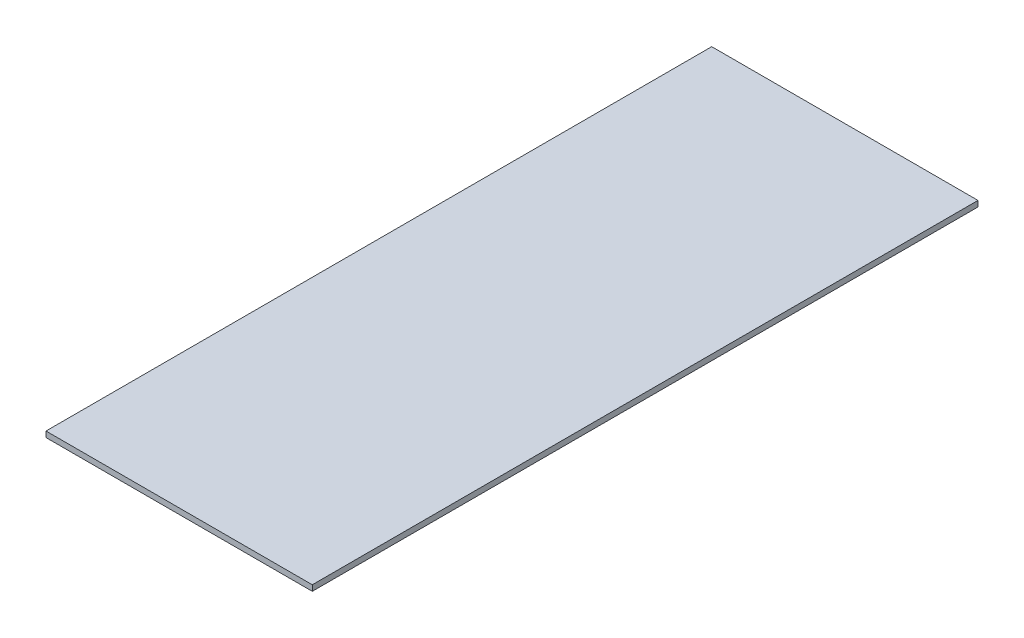
ISO-10303-21;
HEADER;
FILE_DESCRIPTION(('STEP AP214'),'2;1');
FILE_NAME('part.step','',(''),(''),'','','');
FILE_SCHEMA(('AUTOMOTIVE_DESIGN { 1 0 10303 214 1 1 1 1 }'));
ENDSEC;
DATA;
#1=APPLICATION_CONTEXT('core data for automotive mechanical design processes');
#2=APPLICATION_PROTOCOL_DEFINITION('international standard','automotive_design',2000,#1);
#3=PRODUCT_CONTEXT('',#1,'mechanical');
#4=PRODUCT('Part','Part','',(#3));
#5=PRODUCT_RELATED_PRODUCT_CATEGORY('part','',(#4));
#6=PRODUCT_DEFINITION_FORMATION('','',#4);
#7=PRODUCT_DEFINITION_CONTEXT('part definition',#1,'design');
#8=PRODUCT_DEFINITION('design','',#6,#7);
#9=PRODUCT_DEFINITION_SHAPE('','',#8);
#10=(LENGTH_UNIT() NAMED_UNIT(*) SI_UNIT(.MILLI.,.METRE.));
#11=(NAMED_UNIT(*) PLANE_ANGLE_UNIT() SI_UNIT($,.RADIAN.));
#12=(NAMED_UNIT(*) SI_UNIT($,.STERADIAN.) SOLID_ANGLE_UNIT());
#13=UNCERTAINTY_MEASURE_WITH_UNIT(LENGTH_MEASURE(1.E-05),#10,'distance_accuracy_value','');
#14=(GEOMETRIC_REPRESENTATION_CONTEXT(3) GLOBAL_UNCERTAINTY_ASSIGNED_CONTEXT((#13)) GLOBAL_UNIT_ASSIGNED_CONTEXT((#10,
#11,#12)) REPRESENTATION_CONTEXT('',''));
#15=CARTESIAN_POINT('',(0.,0.,0.));
#16=DIRECTION('',(0.,0.,1.));
#17=DIRECTION('',(1.,0.,0.));
#18=AXIS2_PLACEMENT_3D('',#15,#16,#17);
#19=CARTESIAN_POINT('',(0.,3.,0.));
#20=DIRECTION('',(1.,0.,0.));
#21=DIRECTION('',(0.,0.,-1.));
#22=AXIS2_PLACEMENT_3D('',#19,#20,#21);
#23=PLANE('',#22);
#24=DIRECTION('',(0.,0.,1.));
#25=VECTOR('',#24,1.);
#26=CARTESIAN_POINT('',(0.,0.,0.));
#27=LINE('',#26,#25);
#28=CARTESIAN_POINT('',(0.,0.,-350.));
#29=VERTEX_POINT('',#28);
#30=CARTESIAN_POINT('',(0.,0.,0.));
#31=VERTEX_POINT('',#30);
#32=EDGE_CURVE('E109',#29,#31,#27,.T.);
#33=ORIENTED_EDGE('',*,*,#32,.T.);
#34=DIRECTION('',(0.,-1.,0.));
#35=VECTOR('',#34,1.);
#36=CARTESIAN_POINT('',(0.,3.,0.));
#37=LINE('',#36,#35);
#38=CARTESIAN_POINT('',(0.,3.,0.));
#39=VERTEX_POINT('',#38);
#40=EDGE_CURVE('E11',#39,#31,#37,.T.);
#41=ORIENTED_EDGE('',*,*,#40,.F.);
#42=DIRECTION('',(0.,0.,1.));
#43=VECTOR('',#42,1.);
#44=CARTESIAN_POINT('',(0.,3.,0.));
#45=LINE('',#44,#43);
#46=CARTESIAN_POINT('',(0.,3.,-350.));
#47=VERTEX_POINT('',#46);
#48=EDGE_CURVE('E93',#47,#39,#45,.T.);
#49=ORIENTED_EDGE('',*,*,#48,.F.);
#50=DIRECTION('',(0.,-1.,0.));
#51=VECTOR('',#50,1.);
#52=CARTESIAN_POINT('',(0.,3.,-350.));
#53=LINE('',#52,#51);
#54=EDGE_CURVE('E105',#47,#29,#53,.T.);
#55=ORIENTED_EDGE('',*,*,#54,.T.);
#56=EDGE_LOOP('',(#33,#41,#49,#55));
#57=FACE_BOUND('',#56,.T.);
#58=ADVANCED_FACE('F41',(#57),#23,.F.);
#59=CARTESIAN_POINT('',(0.,3.,0.));
#60=DIRECTION('',(0.,0.,-1.));
#61=DIRECTION('',(-1.,0.,0.));
#62=AXIS2_PLACEMENT_3D('',#59,#60,#61);
#63=PLANE('',#62);
#64=DIRECTION('',(1.,0.,0.));
#65=VECTOR('',#64,1.);
#66=CARTESIAN_POINT('',(0.,0.,0.));
#67=LINE('',#66,#65);
#68=CARTESIAN_POINT('',(140.,0.,0.));
#69=VERTEX_POINT('',#68);
#70=EDGE_CURVE('E98',#31,#69,#67,.T.);
#71=ORIENTED_EDGE('',*,*,#70,.T.);
#72=DIRECTION('',(0.,-1.,0.));
#73=VECTOR('',#72,1.);
#74=CARTESIAN_POINT('',(140.,3.,0.));
#75=LINE('',#74,#73);
#76=CARTESIAN_POINT('',(140.,3.,0.));
#77=VERTEX_POINT('',#76);
#78=EDGE_CURVE('E50',#77,#69,#75,.T.);
#79=ORIENTED_EDGE('',*,*,#78,.F.);
#80=DIRECTION('',(1.,0.,0.));
#81=VECTOR('',#80,1.);
#82=CARTESIAN_POINT('',(0.,3.,0.));
#83=LINE('',#82,#81);
#84=EDGE_CURVE('E88',#39,#77,#83,.T.);
#85=ORIENTED_EDGE('',*,*,#84,.F.);
#86=ORIENTED_EDGE('',*,*,#40,.T.);
#87=EDGE_LOOP('',(#71,#79,#85,#86));
#88=FACE_BOUND('',#87,.T.);
#89=ADVANCED_FACE('F97',(#88),#63,.F.);
#90=CARTESIAN_POINT('',(140.,3.,0.));
#91=DIRECTION('',(-1.,0.,0.));
#92=DIRECTION('',(0.,0.,1.));
#93=AXIS2_PLACEMENT_3D('',#90,#91,#92);
#94=PLANE('',#93);
#95=DIRECTION('',(0.,0.,-1.));
#96=VECTOR('',#95,1.);
#97=CARTESIAN_POINT('',(140.,0.,0.));
#98=LINE('',#97,#96);
#99=CARTESIAN_POINT('',(140.,0.,-350.));
#100=VERTEX_POINT('',#99);
#101=EDGE_CURVE('E75',#69,#100,#98,.T.);
#102=ORIENTED_EDGE('',*,*,#101,.T.);
#103=DIRECTION('',(0.,-1.,0.));
#104=VECTOR('',#103,1.);
#105=CARTESIAN_POINT('',(140.,3.,-350.));
#106=LINE('',#105,#104);
#107=CARTESIAN_POINT('',(140.,3.,-350.));
#108=VERTEX_POINT('',#107);
#109=EDGE_CURVE('E100',#108,#100,#106,.T.);
#110=ORIENTED_EDGE('',*,*,#109,.F.);
#111=DIRECTION('',(0.,0.,-1.));
#112=VECTOR('',#111,1.);
#113=CARTESIAN_POINT('',(140.,3.,0.));
#114=LINE('',#113,#112);
#115=EDGE_CURVE('E91',#77,#108,#114,.T.);
#116=ORIENTED_EDGE('',*,*,#115,.F.);
#117=ORIENTED_EDGE('',*,*,#78,.T.);
#118=EDGE_LOOP('',(#102,#110,#116,#117));
#119=FACE_BOUND('',#118,.T.);
#120=ADVANCED_FACE('F101',(#119),#94,.F.);
#121=CARTESIAN_POINT('',(0.,3.,-350.));
#122=DIRECTION('',(0.,0.,1.));
#123=DIRECTION('',(1.,0.,0.));
#124=AXIS2_PLACEMENT_3D('',#121,#122,#123);
#125=PLANE('',#124);
#126=DIRECTION('',(-1.,0.,0.));
#127=VECTOR('',#126,1.);
#128=CARTESIAN_POINT('',(0.,0.,-350.));
#129=LINE('',#128,#127);
#130=EDGE_CURVE('E81',#100,#29,#129,.T.);
#131=ORIENTED_EDGE('',*,*,#130,.T.);
#132=ORIENTED_EDGE('',*,*,#54,.F.);
#133=DIRECTION('',(-1.,0.,0.));
#134=VECTOR('',#133,1.);
#135=CARTESIAN_POINT('',(0.,3.,-350.));
#136=LINE('',#135,#134);
#137=EDGE_CURVE('E58',#108,#47,#136,.T.);
#138=ORIENTED_EDGE('',*,*,#137,.F.);
#139=ORIENTED_EDGE('',*,*,#109,.T.);
#140=EDGE_LOOP('',(#131,#132,#138,#139));
#141=FACE_BOUND('',#140,.T.);
#142=ADVANCED_FACE('F122',(#141),#125,.F.);
#143=CARTESIAN_POINT('',(0.,3.,0.));
#144=DIRECTION('',(0.,-1.,0.));
#145=DIRECTION('',(0.,0.,-1.));
#146=AXIS2_PLACEMENT_3D('',#143,#144,#145);
#147=PLANE('',#146);
#148=ORIENTED_EDGE('',*,*,#48,.T.);
#149=ORIENTED_EDGE('',*,*,#84,.T.);
#150=ORIENTED_EDGE('',*,*,#115,.T.);
#151=ORIENTED_EDGE('',*,*,#137,.T.);
#152=EDGE_LOOP('',(#148,#149,#150,#151));
#153=FACE_BOUND('',#152,.T.);
#154=ADVANCED_FACE('F89',(#153),#147,.F.);
#155=CARTESIAN_POINT('',(0.,0.,0.));
#156=DIRECTION('',(0.,-1.,0.));
#157=DIRECTION('',(0.,0.,-1.));
#158=AXIS2_PLACEMENT_3D('',#155,#156,#157);
#159=PLANE('',#158);
#160=ORIENTED_EDGE('',*,*,#32,.F.);
#161=ORIENTED_EDGE('',*,*,#130,.F.);
#162=ORIENTED_EDGE('',*,*,#101,.F.);
#163=ORIENTED_EDGE('',*,*,#70,.F.);
#164=EDGE_LOOP('',(#160,#161,#162,#163));
#165=FACE_BOUND('',#164,.T.);
#166=ADVANCED_FACE('F125',(#165),#159,.T.);
#167=CLOSED_SHELL('',(#58,#89,#120,#142,#154,#166));
#168=MANIFOLD_SOLID_BREP('B2',#167);
#169=ADVANCED_BREP_SHAPE_REPRESENTATION('',(#18,#168),#14);
#170=SHAPE_DEFINITION_REPRESENTATION(#9,#169);
ENDSEC;
END-ISO-10303-21;
